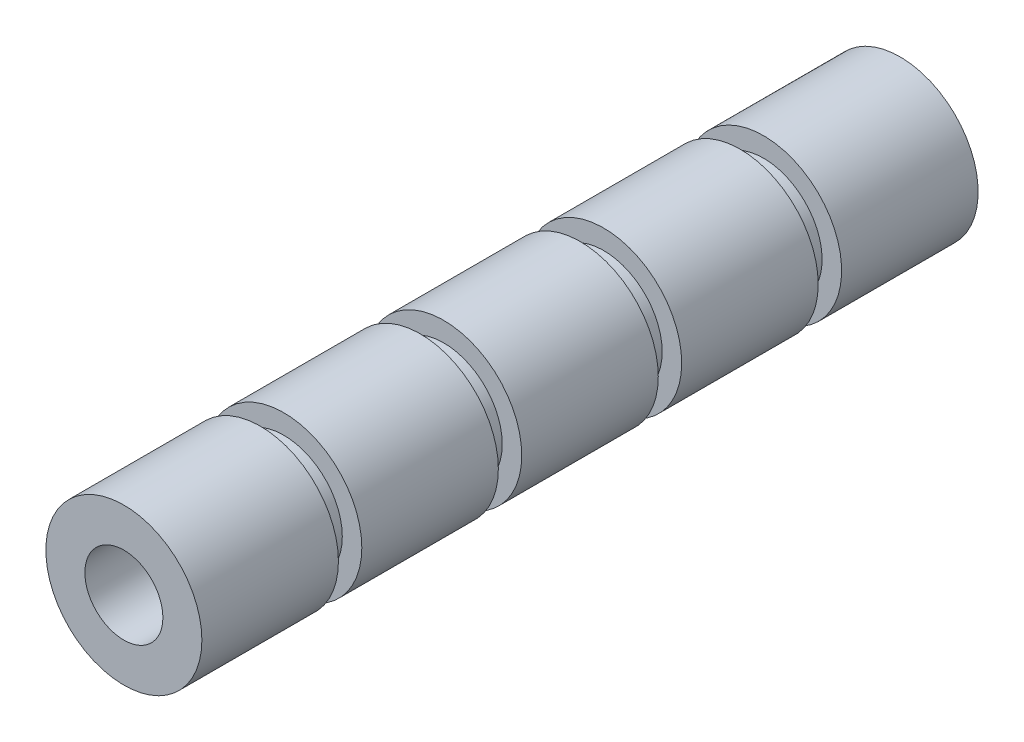
ISO-10303-21;
HEADER;
FILE_DESCRIPTION(('STEP AP214'),'2;1');
FILE_NAME('part.step','',(''),(''),'','','');
FILE_SCHEMA(('AUTOMOTIVE_DESIGN { 1 0 10303 214 1 1 1 1 }'));
ENDSEC;
DATA;
#1=APPLICATION_CONTEXT('core data for automotive mechanical design processes');
#2=APPLICATION_PROTOCOL_DEFINITION('international standard','automotive_design',2000,#1);
#3=PRODUCT_CONTEXT('',#1,'mechanical');
#4=PRODUCT('Part','Part','',(#3));
#5=PRODUCT_RELATED_PRODUCT_CATEGORY('part','',(#4));
#6=PRODUCT_DEFINITION_FORMATION('','',#4);
#7=PRODUCT_DEFINITION_CONTEXT('part definition',#1,'design');
#8=PRODUCT_DEFINITION('design','',#6,#7);
#9=PRODUCT_DEFINITION_SHAPE('','',#8);
#10=(LENGTH_UNIT() NAMED_UNIT(*) SI_UNIT(.MILLI.,.METRE.));
#11=(NAMED_UNIT(*) PLANE_ANGLE_UNIT() SI_UNIT($,.RADIAN.));
#12=(NAMED_UNIT(*) SI_UNIT($,.STERADIAN.) SOLID_ANGLE_UNIT());
#13=UNCERTAINTY_MEASURE_WITH_UNIT(LENGTH_MEASURE(1.E-05),#10,'distance_accuracy_value','');
#14=(GEOMETRIC_REPRESENTATION_CONTEXT(3) GLOBAL_UNCERTAINTY_ASSIGNED_CONTEXT((#13)) GLOBAL_UNIT_ASSIGNED_CONTEXT((#10,
#11,#12)) REPRESENTATION_CONTEXT('',''));
#15=CARTESIAN_POINT('',(0.,0.,0.));
#16=DIRECTION('',(0.,0.,1.));
#17=DIRECTION('',(1.,0.,0.));
#18=AXIS2_PLACEMENT_3D('',#15,#16,#17);
#19=CARTESIAN_POINT('',(0.,0.,99.));
#20=DIRECTION('',(0.,0.,-1.));
#21=DIRECTION('',(-1.,0.,0.));
#22=AXIS2_PLACEMENT_3D('',#19,#20,#21);
#23=CYLINDRICAL_SURFACE('',#22,7.49999999999999);
#24=CARTESIAN_POINT('',(0.,0.,79.));
#25=DIRECTION('',(0.,0.,1.));
#26=DIRECTION('',(1.,0.,0.));
#27=AXIS2_PLACEMENT_3D('',#24,#25,#26);
#28=CIRCLE('',#27,7.49999999999999);
#29=CARTESIAN_POINT('',(7.49999999999999,0.,79.));
#30=VERTEX_POINT('',#29);
#31=EDGE_CURVE('E113',#30,#30,#28,.T.);
#32=ORIENTED_EDGE('',*,*,#31,.T.);
#33=EDGE_LOOP('',(#32));
#34=FACE_BOUND('',#33,.T.);
#35=CARTESIAN_POINT('',(0.,0.,82.));
#36=DIRECTION('',(0.,0.,1.));
#37=DIRECTION('',(1.,0.,0.));
#38=AXIS2_PLACEMENT_3D('',#35,#36,#37);
#39=CIRCLE('',#38,7.49999999999999);
#40=CARTESIAN_POINT('',(7.49999999999999,0.,82.));
#41=VERTEX_POINT('',#40);
#42=EDGE_CURVE('E10',#41,#41,#39,.T.);
#43=ORIENTED_EDGE('',*,*,#42,.F.);
#44=EDGE_LOOP('',(#43));
#45=FACE_BOUND('',#44,.T.);
#46=ADVANCED_FACE('F47',(#34,#45),#23,.T.);
#47=CARTESIAN_POINT('',(0.,0.,58.5));
#48=DIRECTION('',(0.,0.,1.));
#49=DIRECTION('',(1.,0.,0.));
#50=AXIS2_PLACEMENT_3D('',#47,#48,#49);
#51=CIRCLE('',#50,7.49999999999999);
#52=CARTESIAN_POINT('',(7.49999999999999,0.,58.5));
#53=VERTEX_POINT('',#52);
#54=EDGE_CURVE('E103',#53,#53,#51,.T.);
#55=ORIENTED_EDGE('',*,*,#54,.T.);
#56=EDGE_LOOP('',(#55));
#57=FACE_BOUND('',#56,.T.);
#58=CARTESIAN_POINT('',(0.,0.,61.5));
#59=DIRECTION('',(0.,0.,1.));
#60=DIRECTION('',(1.,0.,0.));
#61=AXIS2_PLACEMENT_3D('',#58,#59,#60);
#62=CIRCLE('',#61,7.49999999999999);
#63=CARTESIAN_POINT('',(7.49999999999999,0.,61.5));
#64=VERTEX_POINT('',#63);
#65=EDGE_CURVE('E57',#64,#64,#62,.T.);
#66=ORIENTED_EDGE('',*,*,#65,.F.);
#67=EDGE_LOOP('',(#66));
#68=FACE_BOUND('',#67,.T.);
#69=ADVANCED_FACE('F152',(#57,#68),#23,.T.);
#70=CARTESIAN_POINT('',(0.,0.,38.));
#71=DIRECTION('',(0.,0.,1.));
#72=DIRECTION('',(1.,0.,0.));
#73=AXIS2_PLACEMENT_3D('',#70,#71,#72);
#74=CIRCLE('',#73,7.49999999999999);
#75=CARTESIAN_POINT('',(7.49999999999999,0.,38.));
#76=VERTEX_POINT('',#75);
#77=EDGE_CURVE('E88',#76,#76,#74,.T.);
#78=ORIENTED_EDGE('',*,*,#77,.T.);
#79=EDGE_LOOP('',(#78));
#80=FACE_BOUND('',#79,.T.);
#81=CARTESIAN_POINT('',(0.,0.,41.));
#82=DIRECTION('',(0.,0.,1.));
#83=DIRECTION('',(1.,0.,0.));
#84=AXIS2_PLACEMENT_3D('',#81,#82,#83);
#85=CIRCLE('',#84,7.49999999999999);
#86=CARTESIAN_POINT('',(7.49999999999999,0.,41.));
#87=VERTEX_POINT('',#86);
#88=EDGE_CURVE('E62',#87,#87,#85,.T.);
#89=ORIENTED_EDGE('',*,*,#88,.F.);
#90=EDGE_LOOP('',(#89));
#91=FACE_BOUND('',#90,.T.);
#92=ADVANCED_FACE('F159',(#80,#91),#23,.T.);
#93=CARTESIAN_POINT('',(0.,0.,38.));
#94=DIRECTION('',(0.,0.,1.));
#95=DIRECTION('',(1.,0.,0.));
#96=AXIS2_PLACEMENT_3D('',#93,#94,#95);
#97=PLANE('',#96);
#98=CARTESIAN_POINT('',(0.,0.,38.));
#99=DIRECTION('',(0.,0.,1.));
#100=DIRECTION('',(1.,0.,0.));
#101=AXIS2_PLACEMENT_3D('',#98,#99,#100);
#102=CIRCLE('',#101,10.);
#103=CARTESIAN_POINT('',(10.,0.,38.));
#104=VERTEX_POINT('',#103);
#105=EDGE_CURVE('E82',#104,#104,#102,.T.);
#106=ORIENTED_EDGE('',*,*,#105,.T.);
#107=EDGE_LOOP('',(#106));
#108=FACE_BOUND('',#107,.T.);
#109=ORIENTED_EDGE('',*,*,#77,.F.);
#110=EDGE_LOOP('',(#109));
#111=FACE_BOUND('',#110,.T.);
#112=ADVANCED_FACE('F177',(#108,#111),#97,.T.);
#113=CARTESIAN_POINT('',(0.,0.,20.5));
#114=DIRECTION('',(0.,0.,1.));
#115=DIRECTION('',(1.,0.,0.));
#116=AXIS2_PLACEMENT_3D('',#113,#114,#115);
#117=PLANE('',#116);
#118=CARTESIAN_POINT('',(0.,0.,20.5));
#119=DIRECTION('',(0.,0.,1.));
#120=DIRECTION('',(1.,0.,0.));
#121=AXIS2_PLACEMENT_3D('',#118,#119,#120);
#122=CIRCLE('',#121,10.);
#123=CARTESIAN_POINT('',(10.,0.,20.5));
#124=VERTEX_POINT('',#123);
#125=EDGE_CURVE('E83',#124,#124,#122,.T.);
#126=ORIENTED_EDGE('',*,*,#125,.F.);
#127=EDGE_LOOP('',(#126));
#128=FACE_BOUND('',#127,.T.);
#129=CARTESIAN_POINT('',(0.,0.,20.5));
#130=DIRECTION('',(0.,0.,1.));
#131=DIRECTION('',(1.,0.,0.));
#132=AXIS2_PLACEMENT_3D('',#129,#130,#131);
#133=CIRCLE('',#132,7.49999999999999);
#134=CARTESIAN_POINT('',(7.49999999999999,0.,20.5));
#135=VERTEX_POINT('',#134);
#136=EDGE_CURVE('E66',#135,#135,#133,.T.);
#137=ORIENTED_EDGE('',*,*,#136,.T.);
#138=EDGE_LOOP('',(#137));
#139=FACE_BOUND('',#138,.T.);
#140=ADVANCED_FACE('F183',(#128,#139),#117,.F.);
#141=CARTESIAN_POINT('',(0.,0.,38.));
#142=DIRECTION('',(0.,0.,-1.));
#143=DIRECTION('',(-1.,0.,0.));
#144=AXIS2_PLACEMENT_3D('',#141,#142,#143);
#145=CYLINDRICAL_SURFACE('',#144,10.);
#146=ORIENTED_EDGE('',*,*,#105,.F.);
#147=EDGE_LOOP('',(#146));
#148=FACE_BOUND('',#147,.T.);
#149=ORIENTED_EDGE('',*,*,#125,.T.);
#150=EDGE_LOOP('',(#149));
#151=FACE_BOUND('',#150,.T.);
#152=ADVANCED_FACE('F207',(#148,#151),#145,.T.);
#153=CARTESIAN_POINT('',(0.,0.,0.));
#154=DIRECTION('',(0.,0.,1.));
#155=DIRECTION('',(1.,0.,0.));
#156=AXIS2_PLACEMENT_3D('',#153,#154,#155);
#157=PLANE('',#156);
#158=CARTESIAN_POINT('',(0.,0.,0.));
#159=DIRECTION('',(0.,0.,1.));
#160=DIRECTION('',(1.,0.,0.));
#161=AXIS2_PLACEMENT_3D('',#158,#159,#160);
#162=CIRCLE('',#161,5.);
#163=CARTESIAN_POINT('',(5.,0.,0.));
#164=VERTEX_POINT('',#163);
#165=EDGE_CURVE('E135',#164,#164,#162,.T.);
#166=ORIENTED_EDGE('',*,*,#165,.T.);
#167=EDGE_LOOP('',(#166));
#168=FACE_BOUND('',#167,.T.);
#169=CARTESIAN_POINT('',(0.,0.,0.));
#170=DIRECTION('',(0.,0.,-1.));
#171=DIRECTION('',(-1.,0.,0.));
#172=AXIS2_PLACEMENT_3D('',#169,#170,#171);
#173=CIRCLE('',#172,10.);
#174=CARTESIAN_POINT('',(-10.,0.,0.));
#175=VERTEX_POINT('',#174);
#176=EDGE_CURVE('E80',#175,#175,#173,.T.);
#177=ORIENTED_EDGE('',*,*,#176,.T.);
#178=EDGE_LOOP('',(#177));
#179=FACE_BOUND('',#178,.T.);
#180=ADVANCED_FACE('F140',(#168,#179),#157,.F.);
#181=CARTESIAN_POINT('',(0.,0.,17.5));
#182=DIRECTION('',(0.,0.,-1.));
#183=DIRECTION('',(-1.,0.,0.));
#184=AXIS2_PLACEMENT_3D('',#181,#182,#183);
#185=CYLINDRICAL_SURFACE('',#184,10.);
#186=CARTESIAN_POINT('',(0.,0.,17.5));
#187=DIRECTION('',(0.,0.,-1.));
#188=DIRECTION('',(-1.,0.,0.));
#189=AXIS2_PLACEMENT_3D('',#186,#187,#188);
#190=CIRCLE('',#189,10.);
#191=CARTESIAN_POINT('',(-10.,0.,17.5));
#192=VERTEX_POINT('',#191);
#193=EDGE_CURVE('E77',#192,#192,#190,.T.);
#194=ORIENTED_EDGE('',*,*,#193,.T.);
#195=EDGE_LOOP('',(#194));
#196=FACE_BOUND('',#195,.T.);
#197=ORIENTED_EDGE('',*,*,#176,.F.);
#198=EDGE_LOOP('',(#197));
#199=FACE_BOUND('',#198,.T.);
#200=ADVANCED_FACE('F173',(#196,#199),#185,.T.);
#201=CARTESIAN_POINT('',(0.,0.,17.5));
#202=DIRECTION('',(0.,0.,-1.));
#203=DIRECTION('',(-1.,0.,0.));
#204=AXIS2_PLACEMENT_3D('',#201,#202,#203);
#205=PLANE('',#204);
#206=CARTESIAN_POINT('',(0.,0.,17.5));
#207=DIRECTION('',(0.,0.,-1.));
#208=DIRECTION('',(-1.,0.,0.));
#209=AXIS2_PLACEMENT_3D('',#206,#207,#208);
#210=CIRCLE('',#209,7.49999999999999);
#211=CARTESIAN_POINT('',(-7.49999999999999,0.,17.5));
#212=VERTEX_POINT('',#211);
#213=EDGE_CURVE('E75',#212,#212,#210,.T.);
#214=ORIENTED_EDGE('',*,*,#213,.T.);
#215=EDGE_LOOP('',(#214));
#216=FACE_BOUND('',#215,.T.);
#217=ORIENTED_EDGE('',*,*,#193,.F.);
#218=EDGE_LOOP('',(#217));
#219=FACE_BOUND('',#218,.T.);
#220=ADVANCED_FACE('F165',(#216,#219),#205,.F.);
#221=ORIENTED_EDGE('',*,*,#213,.F.);
#222=EDGE_LOOP('',(#221));
#223=FACE_BOUND('',#222,.T.);
#224=ORIENTED_EDGE('',*,*,#136,.F.);
#225=EDGE_LOOP('',(#224));
#226=FACE_BOUND('',#225,.T.);
#227=ADVANCED_FACE('F154',(#223,#226),#23,.T.);
#228=CARTESIAN_POINT('',(0.,0.,58.5));
#229=DIRECTION('',(0.,0.,1.));
#230=DIRECTION('',(1.,0.,0.));
#231=AXIS2_PLACEMENT_3D('',#228,#229,#230);
#232=PLANE('',#231);
#233=CARTESIAN_POINT('',(0.,0.,58.5));
#234=DIRECTION('',(0.,0.,1.));
#235=DIRECTION('',(1.,0.,0.));
#236=AXIS2_PLACEMENT_3D('',#233,#234,#235);
#237=CIRCLE('',#236,10.);
#238=CARTESIAN_POINT('',(10.,0.,58.5));
#239=VERTEX_POINT('',#238);
#240=EDGE_CURVE('E98',#239,#239,#237,.T.);
#241=ORIENTED_EDGE('',*,*,#240,.T.);
#242=EDGE_LOOP('',(#241));
#243=FACE_BOUND('',#242,.T.);
#244=ORIENTED_EDGE('',*,*,#54,.F.);
#245=EDGE_LOOP('',(#244));
#246=FACE_BOUND('',#245,.T.);
#247=ADVANCED_FACE('F161',(#243,#246),#232,.T.);
#248=CARTESIAN_POINT('',(0.,0.,41.));
#249=DIRECTION('',(0.,0.,1.));
#250=DIRECTION('',(1.,0.,0.));
#251=AXIS2_PLACEMENT_3D('',#248,#249,#250);
#252=PLANE('',#251);
#253=CARTESIAN_POINT('',(0.,0.,41.));
#254=DIRECTION('',(0.,0.,1.));
#255=DIRECTION('',(1.,0.,0.));
#256=AXIS2_PLACEMENT_3D('',#253,#254,#255);
#257=CIRCLE('',#256,10.);
#258=CARTESIAN_POINT('',(10.,0.,41.));
#259=VERTEX_POINT('',#258);
#260=EDGE_CURVE('E97',#259,#259,#257,.T.);
#261=ORIENTED_EDGE('',*,*,#260,.F.);
#262=EDGE_LOOP('',(#261));
#263=FACE_BOUND('',#262,.T.);
#264=ORIENTED_EDGE('',*,*,#88,.T.);
#265=EDGE_LOOP('',(#264));
#266=FACE_BOUND('',#265,.T.);
#267=ADVANCED_FACE('F167',(#263,#266),#252,.F.);
#268=CARTESIAN_POINT('',(0.,0.,58.5));
#269=DIRECTION('',(0.,0.,-1.));
#270=DIRECTION('',(-1.,0.,0.));
#271=AXIS2_PLACEMENT_3D('',#268,#269,#270);
#272=CYLINDRICAL_SURFACE('',#271,10.);
#273=ORIENTED_EDGE('',*,*,#240,.F.);
#274=EDGE_LOOP('',(#273));
#275=FACE_BOUND('',#274,.T.);
#276=ORIENTED_EDGE('',*,*,#260,.T.);
#277=EDGE_LOOP('',(#276));
#278=FACE_BOUND('',#277,.T.);
#279=ADVANCED_FACE('F195',(#275,#278),#272,.T.);
#280=CARTESIAN_POINT('',(0.,0.,79.));
#281=DIRECTION('',(0.,0.,1.));
#282=DIRECTION('',(1.,0.,0.));
#283=AXIS2_PLACEMENT_3D('',#280,#281,#282);
#284=PLANE('',#283);
#285=CARTESIAN_POINT('',(0.,0.,79.));
#286=DIRECTION('',(0.,0.,1.));
#287=DIRECTION('',(1.,0.,0.));
#288=AXIS2_PLACEMENT_3D('',#285,#286,#287);
#289=CIRCLE('',#288,10.);
#290=CARTESIAN_POINT('',(10.,0.,79.));
#291=VERTEX_POINT('',#290);
#292=EDGE_CURVE('E108',#291,#291,#289,.T.);
#293=ORIENTED_EDGE('',*,*,#292,.T.);
#294=EDGE_LOOP('',(#293));
#295=FACE_BOUND('',#294,.T.);
#296=ORIENTED_EDGE('',*,*,#31,.F.);
#297=EDGE_LOOP('',(#296));
#298=FACE_BOUND('',#297,.T.);
#299=ADVANCED_FACE('F197',(#295,#298),#284,.T.);
#300=CARTESIAN_POINT('',(0.,0.,61.5));
#301=DIRECTION('',(0.,0.,1.));
#302=DIRECTION('',(1.,0.,0.));
#303=AXIS2_PLACEMENT_3D('',#300,#301,#302);
#304=PLANE('',#303);
#305=CARTESIAN_POINT('',(0.,0.,61.5));
#306=DIRECTION('',(0.,0.,1.));
#307=DIRECTION('',(1.,0.,0.));
#308=AXIS2_PLACEMENT_3D('',#305,#306,#307);
#309=CIRCLE('',#308,10.);
#310=CARTESIAN_POINT('',(10.,0.,61.5));
#311=VERTEX_POINT('',#310);
#312=EDGE_CURVE('E107',#311,#311,#309,.T.);
#313=ORIENTED_EDGE('',*,*,#312,.F.);
#314=EDGE_LOOP('',(#313));
#315=FACE_BOUND('',#314,.T.);
#316=ORIENTED_EDGE('',*,*,#65,.T.);
#317=EDGE_LOOP('',(#316));
#318=FACE_BOUND('',#317,.T.);
#319=ADVANCED_FACE('F281',(#315,#318),#304,.F.);
#320=CARTESIAN_POINT('',(0.,0.,79.));
#321=DIRECTION('',(0.,0.,-1.));
#322=DIRECTION('',(-1.,0.,0.));
#323=AXIS2_PLACEMENT_3D('',#320,#321,#322);
#324=CYLINDRICAL_SURFACE('',#323,10.);
#325=ORIENTED_EDGE('',*,*,#292,.F.);
#326=EDGE_LOOP('',(#325));
#327=FACE_BOUND('',#326,.T.);
#328=ORIENTED_EDGE('',*,*,#312,.T.);
#329=EDGE_LOOP('',(#328));
#330=FACE_BOUND('',#329,.T.);
#331=ADVANCED_FACE('F299',(#327,#330),#324,.T.);
#332=CARTESIAN_POINT('',(0.,0.,99.5));
#333=DIRECTION('',(0.,0.,1.));
#334=DIRECTION('',(1.,0.,0.));
#335=AXIS2_PLACEMENT_3D('',#332,#333,#334);
#336=PLANE('',#335);
#337=CARTESIAN_POINT('',(0.,0.,99.5));
#338=DIRECTION('',(0.,0.,1.));
#339=DIRECTION('',(1.,0.,0.));
#340=AXIS2_PLACEMENT_3D('',#337,#338,#339);
#341=CIRCLE('',#340,10.);
#342=CARTESIAN_POINT('',(10.,0.,99.5));
#343=VERTEX_POINT('',#342);
#344=EDGE_CURVE('E119',#343,#343,#341,.T.);
#345=ORIENTED_EDGE('',*,*,#344,.T.);
#346=EDGE_LOOP('',(#345));
#347=FACE_BOUND('',#346,.T.);
#348=CARTESIAN_POINT('',(0.,0.,99.5));
#349=DIRECTION('',(0.,0.,1.));
#350=DIRECTION('',(1.,0.,0.));
#351=AXIS2_PLACEMENT_3D('',#348,#349,#350);
#352=CIRCLE('',#351,5.);
#353=CARTESIAN_POINT('',(5.,0.,99.5));
#354=VERTEX_POINT('',#353);
#355=EDGE_CURVE('E123',#354,#354,#352,.T.);
#356=ORIENTED_EDGE('',*,*,#355,.F.);
#357=EDGE_LOOP('',(#356));
#358=FACE_BOUND('',#357,.T.);
#359=ADVANCED_FACE('F270',(#347,#358),#336,.T.);
#360=CARTESIAN_POINT('',(0.,0.,82.));
#361=DIRECTION('',(0.,0.,1.));
#362=DIRECTION('',(1.,0.,0.));
#363=AXIS2_PLACEMENT_3D('',#360,#361,#362);
#364=PLANE('',#363);
#365=CARTESIAN_POINT('',(0.,0.,82.));
#366=DIRECTION('',(0.,0.,1.));
#367=DIRECTION('',(1.,0.,0.));
#368=AXIS2_PLACEMENT_3D('',#365,#366,#367);
#369=CIRCLE('',#368,10.);
#370=CARTESIAN_POINT('',(10.,0.,82.));
#371=VERTEX_POINT('',#370);
#372=EDGE_CURVE('E122',#371,#371,#369,.T.);
#373=ORIENTED_EDGE('',*,*,#372,.F.);
#374=EDGE_LOOP('',(#373));
#375=FACE_BOUND('',#374,.T.);
#376=ORIENTED_EDGE('',*,*,#42,.T.);
#377=EDGE_LOOP('',(#376));
#378=FACE_BOUND('',#377,.T.);
#379=ADVANCED_FACE('F149',(#375,#378),#364,.F.);
#380=CARTESIAN_POINT('',(0.,0.,99.5));
#381=DIRECTION('',(0.,0.,-1.));
#382=DIRECTION('',(-1.,0.,0.));
#383=AXIS2_PLACEMENT_3D('',#380,#381,#382);
#384=CYLINDRICAL_SURFACE('',#383,10.);
#385=ORIENTED_EDGE('',*,*,#344,.F.);
#386=EDGE_LOOP('',(#385));
#387=FACE_BOUND('',#386,.T.);
#388=ORIENTED_EDGE('',*,*,#372,.T.);
#389=EDGE_LOOP('',(#388));
#390=FACE_BOUND('',#389,.T.);
#391=ADVANCED_FACE('F145',(#387,#390),#384,.T.);
#392=CARTESIAN_POINT('',(0.,0.,99.));
#393=DIRECTION('',(0.,0.,-1.));
#394=DIRECTION('',(-1.,0.,0.));
#395=AXIS2_PLACEMENT_3D('',#392,#393,#394);
#396=CYLINDRICAL_SURFACE('',#395,5.);
#397=ORIENTED_EDGE('',*,*,#355,.T.);
#398=EDGE_LOOP('',(#397));
#399=FACE_BOUND('',#398,.T.);
#400=ORIENTED_EDGE('',*,*,#165,.F.);
#401=EDGE_LOOP('',(#400));
#402=FACE_BOUND('',#401,.T.);
#403=ADVANCED_FACE('F136',(#399,#402),#396,.F.);
#404=CLOSED_SHELL('',(#46,#69,#92,#112,#140,#152,#180,#200,#220,#227,#247,#267,#279,#299,#319,
#331,#359,#379,#391,#403));
#405=MANIFOLD_SOLID_BREP('B2',#404);
#406=ADVANCED_BREP_SHAPE_REPRESENTATION('',(#18,#405),#14);
#407=SHAPE_DEFINITION_REPRESENTATION(#9,#406);
ENDSEC;
END-ISO-10303-21;
